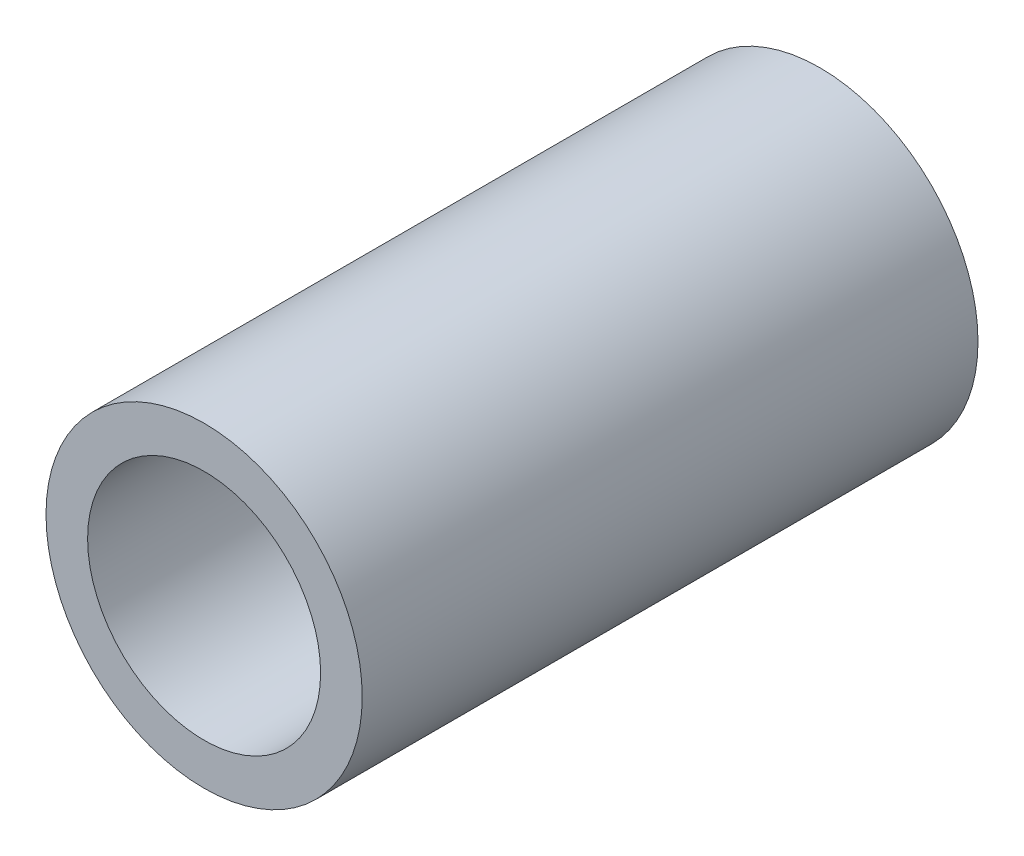
ISO-10303-21;
HEADER;
FILE_DESCRIPTION(('STEP AP214'),'2;1');
FILE_NAME('part.step','',(''),(''),'','','');
FILE_SCHEMA(('AUTOMOTIVE_DESIGN { 1 0 10303 214 1 1 1 1 }'));
ENDSEC;
DATA;
#1=APPLICATION_CONTEXT('core data for automotive mechanical design processes');
#2=APPLICATION_PROTOCOL_DEFINITION('international standard','automotive_design',2000,#1);
#3=PRODUCT_CONTEXT('',#1,'mechanical');
#4=PRODUCT('Part','Part','',(#3));
#5=PRODUCT_RELATED_PRODUCT_CATEGORY('part','',(#4));
#6=PRODUCT_DEFINITION_FORMATION('','',#4);
#7=PRODUCT_DEFINITION_CONTEXT('part definition',#1,'design');
#8=PRODUCT_DEFINITION('design','',#6,#7);
#9=PRODUCT_DEFINITION_SHAPE('','',#8);
#10=(LENGTH_UNIT() NAMED_UNIT(*) SI_UNIT(.MILLI.,.METRE.));
#11=(NAMED_UNIT(*) PLANE_ANGLE_UNIT() SI_UNIT($,.RADIAN.));
#12=(NAMED_UNIT(*) SI_UNIT($,.STERADIAN.) SOLID_ANGLE_UNIT());
#13=UNCERTAINTY_MEASURE_WITH_UNIT(LENGTH_MEASURE(1.E-05),#10,'distance_accuracy_value','');
#14=(GEOMETRIC_REPRESENTATION_CONTEXT(3) GLOBAL_UNCERTAINTY_ASSIGNED_CONTEXT((#13)) GLOBAL_UNIT_ASSIGNED_CONTEXT((#10,
#11,#12)) REPRESENTATION_CONTEXT('',''));
#15=CARTESIAN_POINT('',(0.,0.,0.));
#16=DIRECTION('',(0.,0.,1.));
#17=DIRECTION('',(1.,0.,0.));
#18=AXIS2_PLACEMENT_3D('',#15,#16,#17);
#19=CARTESIAN_POINT('',(0.,0.,37.));
#20=DIRECTION('',(0.,0.,1.));
#21=DIRECTION('',(1.,0.,0.));
#22=AXIS2_PLACEMENT_3D('',#19,#20,#21);
#23=PLANE('',#22);
#24=CARTESIAN_POINT('',(0.,0.,37.));
#25=DIRECTION('',(0.,0.,1.));
#26=DIRECTION('',(1.,0.,0.));
#27=AXIS2_PLACEMENT_3D('',#24,#25,#26);
#28=CIRCLE('',#27,9.5);
#29=CARTESIAN_POINT('',(9.5,0.,37.));
#30=VERTEX_POINT('',#29);
#31=EDGE_CURVE('E10',#30,#30,#28,.T.);
#32=ORIENTED_EDGE('',*,*,#31,.T.);
#33=EDGE_LOOP('',(#32));
#34=FACE_BOUND('',#33,.T.);
#35=CARTESIAN_POINT('',(0.,0.,37.));
#36=DIRECTION('',(0.,0.,1.));
#37=DIRECTION('',(1.,0.,0.));
#38=AXIS2_PLACEMENT_3D('',#35,#36,#37);
#39=CIRCLE('',#38,7.);
#40=CARTESIAN_POINT('',(7.,0.,37.));
#41=VERTEX_POINT('',#40);
#42=EDGE_CURVE('E41',#41,#41,#39,.T.);
#43=ORIENTED_EDGE('',*,*,#42,.F.);
#44=EDGE_LOOP('',(#43));
#45=FACE_BOUND('',#44,.T.);
#46=ADVANCED_FACE('F30',(#34,#45),#23,.T.);
#47=CARTESIAN_POINT('',(0.,0.,0.));
#48=DIRECTION('',(0.,0.,1.));
#49=DIRECTION('',(1.,0.,0.));
#50=AXIS2_PLACEMENT_3D('',#47,#48,#49);
#51=PLANE('',#50);
#52=CARTESIAN_POINT('',(0.,0.,0.));
#53=DIRECTION('',(0.,0.,1.));
#54=DIRECTION('',(1.,0.,0.));
#55=AXIS2_PLACEMENT_3D('',#52,#53,#54);
#56=CIRCLE('',#55,9.5);
#57=CARTESIAN_POINT('',(9.5,0.,0.));
#58=VERTEX_POINT('',#57);
#59=EDGE_CURVE('E34',#58,#58,#56,.T.);
#60=ORIENTED_EDGE('',*,*,#59,.F.);
#61=EDGE_LOOP('',(#60));
#62=FACE_BOUND('',#61,.T.);
#63=CARTESIAN_POINT('',(0.,0.,0.));
#64=DIRECTION('',(0.,0.,1.));
#65=DIRECTION('',(1.,0.,0.));
#66=AXIS2_PLACEMENT_3D('',#63,#64,#65);
#67=CIRCLE('',#66,7.);
#68=CARTESIAN_POINT('',(7.,0.,0.));
#69=VERTEX_POINT('',#68);
#70=EDGE_CURVE('E43',#69,#69,#67,.T.);
#71=ORIENTED_EDGE('',*,*,#70,.T.);
#72=EDGE_LOOP('',(#71));
#73=FACE_BOUND('',#72,.T.);
#74=ADVANCED_FACE('F53',(#62,#73),#51,.F.);
#75=CARTESIAN_POINT('',(0.,0.,37.));
#76=DIRECTION('',(0.,0.,-1.));
#77=DIRECTION('',(-1.,0.,0.));
#78=AXIS2_PLACEMENT_3D('',#75,#76,#77);
#79=CYLINDRICAL_SURFACE('',#78,9.5);
#80=ORIENTED_EDGE('',*,*,#31,.F.);
#81=EDGE_LOOP('',(#80));
#82=FACE_BOUND('',#81,.T.);
#83=ORIENTED_EDGE('',*,*,#59,.T.);
#84=EDGE_LOOP('',(#83));
#85=FACE_BOUND('',#84,.T.);
#86=ADVANCED_FACE('F32',(#82,#85),#79,.T.);
#87=CARTESIAN_POINT('',(0.,0.,37.));
#88=DIRECTION('',(0.,0.,-1.));
#89=DIRECTION('',(-1.,0.,0.));
#90=AXIS2_PLACEMENT_3D('',#87,#88,#89);
#91=CYLINDRICAL_SURFACE('',#90,7.);
#92=ORIENTED_EDGE('',*,*,#42,.T.);
#93=EDGE_LOOP('',(#92));
#94=FACE_BOUND('',#93,.T.);
#95=ORIENTED_EDGE('',*,*,#70,.F.);
#96=EDGE_LOOP('',(#95));
#97=FACE_BOUND('',#96,.T.);
#98=ADVANCED_FACE('F49',(#94,#97),#91,.F.);
#99=CLOSED_SHELL('',(#46,#74,#86,#98));
#100=MANIFOLD_SOLID_BREP('B2',#99);
#101=ADVANCED_BREP_SHAPE_REPRESENTATION('',(#18,#100),#14);
#102=SHAPE_DEFINITION_REPRESENTATION(#9,#101);
ENDSEC;
END-ISO-10303-21;
